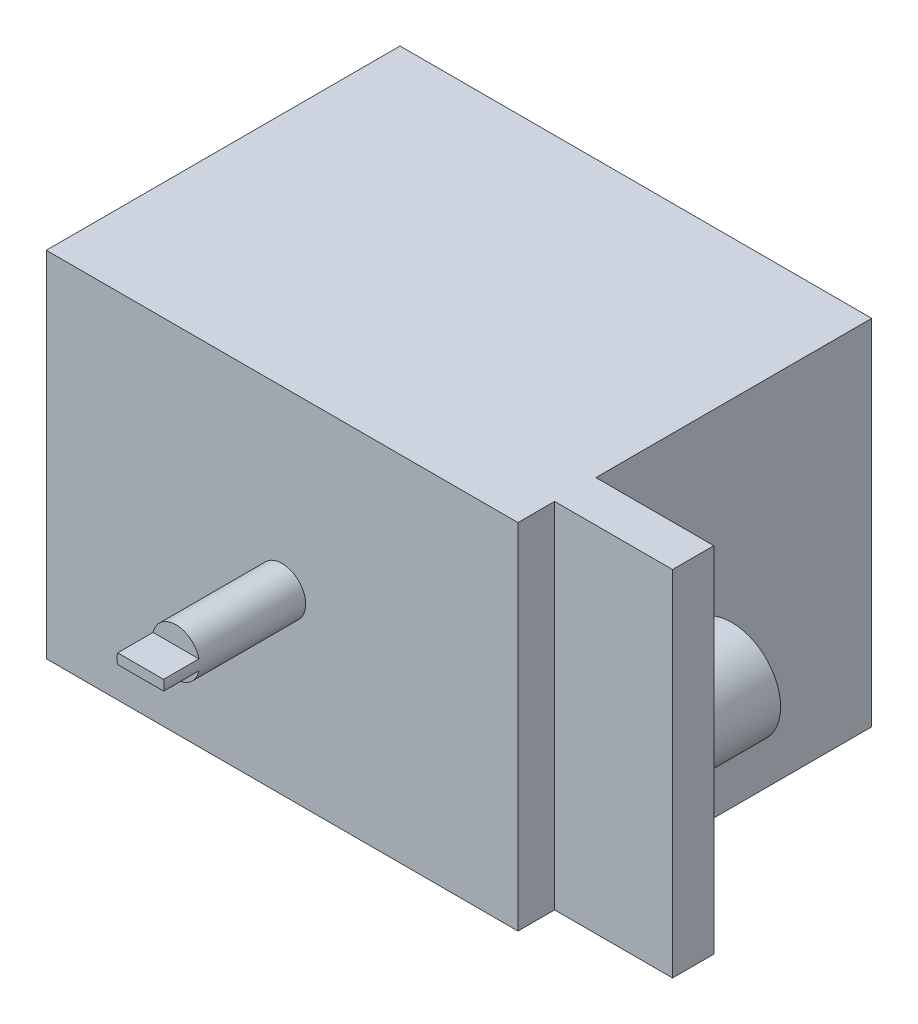
ISO-10303-21;
HEADER;
FILE_DESCRIPTION(('STEP AP214'),'2;1');
FILE_NAME('part.step','',(''),(''),'','','');
FILE_SCHEMA(('AUTOMOTIVE_DESIGN { 1 0 10303 214 1 1 1 1 }'));
ENDSEC;
DATA;
#1=APPLICATION_CONTEXT('core data for automotive mechanical design processes');
#2=APPLICATION_PROTOCOL_DEFINITION('international standard','automotive_design',2000,#1);
#3=PRODUCT_CONTEXT('',#1,'mechanical');
#4=PRODUCT('Part','Part','',(#3));
#5=PRODUCT_RELATED_PRODUCT_CATEGORY('part','',(#4));
#6=PRODUCT_DEFINITION_FORMATION('','',#4);
#7=PRODUCT_DEFINITION_CONTEXT('part definition',#1,'design');
#8=PRODUCT_DEFINITION('design','',#6,#7);
#9=PRODUCT_DEFINITION_SHAPE('','',#8);
#10=(LENGTH_UNIT() NAMED_UNIT(*) SI_UNIT(.MILLI.,.METRE.));
#11=(NAMED_UNIT(*) PLANE_ANGLE_UNIT() SI_UNIT($,.RADIAN.));
#12=(NAMED_UNIT(*) SI_UNIT($,.STERADIAN.) SOLID_ANGLE_UNIT());
#13=UNCERTAINTY_MEASURE_WITH_UNIT(LENGTH_MEASURE(1.E-05),#10,'distance_accuracy_value','');
#14=(GEOMETRIC_REPRESENTATION_CONTEXT(3) GLOBAL_UNCERTAINTY_ASSIGNED_CONTEXT((#13)) GLOBAL_UNIT_ASSIGNED_CONTEXT((#10,
#11,#12)) REPRESENTATION_CONTEXT('',''));
#15=CARTESIAN_POINT('',(0.,0.,0.));
#16=DIRECTION('',(0.,0.,1.));
#17=DIRECTION('',(1.,0.,0.));
#18=AXIS2_PLACEMENT_3D('',#15,#16,#17);
#19=CARTESIAN_POINT('',(100.,-75.0000000000002,150.));
#20=DIRECTION('',(-1.,0.,0.));
#21=DIRECTION('',(0.,0.,1.));
#22=AXIS2_PLACEMENT_3D('',#19,#20,#21);
#23=PLANE('',#22);
#24=DIRECTION('',(0.,-1.,0.));
#25=VECTOR('',#24,1.);
#26=CARTESIAN_POINT('',(99.9999999999999,74.9999999999997,134.460411656031));
#27=LINE('',#26,#25);
#28=CARTESIAN_POINT('',(99.9999999999999,74.9999999999997,134.460411656031));
#29=VERTEX_POINT('',#28);
#30=CARTESIAN_POINT('',(100.,-75.0000000000007,134.460411656031));
#31=VERTEX_POINT('',#30);
#32=EDGE_CURVE('E168',#29,#31,#27,.T.);
#33=ORIENTED_EDGE('',*,*,#32,.F.);
#34=DIRECTION('',(0.,0.,-1.));
#35=VECTOR('',#34,1.);
#36=CARTESIAN_POINT('',(100.,74.9999999999997,150.));
#37=LINE('',#36,#35);
#38=CARTESIAN_POINT('',(100.,74.9999999999997,150.));
#39=VERTEX_POINT('',#38);
#40=EDGE_CURVE('E236',#39,#29,#37,.T.);
#41=ORIENTED_EDGE('',*,*,#40,.F.);
#42=DIRECTION('',(0.,1.,0.));
#43=VECTOR('',#42,1.);
#44=CARTESIAN_POINT('',(100.,-75.0000000000002,150.));
#45=LINE('',#44,#43);
#46=CARTESIAN_POINT('',(100.,-75.0000000000002,150.));
#47=VERTEX_POINT('',#46);
#48=EDGE_CURVE('E208',#47,#39,#45,.T.);
#49=ORIENTED_EDGE('',*,*,#48,.F.);
#50=DIRECTION('',(0.,0.,-1.));
#51=VECTOR('',#50,1.);
#52=CARTESIAN_POINT('',(100.,-75.0000000000002,150.));
#53=LINE('',#52,#51);
#54=EDGE_CURVE('E227',#47,#31,#53,.T.);
#55=ORIENTED_EDGE('',*,*,#54,.T.);
#56=EDGE_LOOP('',(#33,#41,#49,#55));
#57=FACE_BOUND('',#56,.T.);
#58=ADVANCED_FACE('F46',(#57),#23,.F.);
#59=DIRECTION('',(0.,1.,0.));
#60=VECTOR('',#59,1.);
#61=CARTESIAN_POINT('',(100.,74.9999999999988,116.966786996462));
#62=LINE('',#61,#60);
#63=CARTESIAN_POINT('',(100.,-75.0000000000016,116.966786996462));
#64=VERTEX_POINT('',#63);
#65=CARTESIAN_POINT('',(100.,74.9999999999988,116.966786996462));
#66=VERTEX_POINT('',#65);
#67=EDGE_CURVE('E173',#64,#66,#62,.T.);
#68=ORIENTED_EDGE('',*,*,#67,.F.);
#69=CARTESIAN_POINT('',(100.,-75.0000000000002,0.));
#70=VERTEX_POINT('',#69);
#71=EDGE_CURVE('E218',#64,#70,#53,.T.);
#72=ORIENTED_EDGE('',*,*,#71,.T.);
#73=DIRECTION('',(0.,1.,0.));
#74=VECTOR('',#73,1.);
#75=CARTESIAN_POINT('',(100.,-75.0000000000002,0.));
#76=LINE('',#75,#74);
#77=CARTESIAN_POINT('',(100.,75.0000000000002,0.));
#78=VERTEX_POINT('',#77);
#79=EDGE_CURVE('E205',#70,#78,#76,.T.);
#80=ORIENTED_EDGE('',*,*,#79,.T.);
#81=EDGE_CURVE('E235',#66,#78,#37,.T.);
#82=ORIENTED_EDGE('',*,*,#81,.F.);
#83=EDGE_LOOP('',(#68,#72,#80,#82));
#84=FACE_BOUND('',#83,.T.);
#85=ADVANCED_FACE('F268',(#84),#23,.F.);
#86=CARTESIAN_POINT('',(-100.,74.9999999999997,150.));
#87=DIRECTION('',(0.,-1.,0.));
#88=DIRECTION('',(0.,0.,-1.));
#89=AXIS2_PLACEMENT_3D('',#86,#87,#88);
#90=PLANE('',#89);
#91=DIRECTION('',(-1.,0.,0.));
#92=VECTOR('',#91,1.);
#93=CARTESIAN_POINT('',(-100.,74.9999999999997,0.));
#94=LINE('',#93,#92);
#95=CARTESIAN_POINT('',(-100.,74.9999999999997,0.));
#96=VERTEX_POINT('',#95);
#97=EDGE_CURVE('E221',#78,#96,#94,.T.);
#98=ORIENTED_EDGE('',*,*,#97,.T.);
#99=DIRECTION('',(0.,0.,-1.));
#100=VECTOR('',#99,1.);
#101=CARTESIAN_POINT('',(-100.,74.9999999999997,150.));
#102=LINE('',#101,#100);
#103=CARTESIAN_POINT('',(-100.,74.9999999999997,150.));
#104=VERTEX_POINT('',#103);
#105=EDGE_CURVE('E232',#104,#96,#102,.T.);
#106=ORIENTED_EDGE('',*,*,#105,.F.);
#107=DIRECTION('',(-1.,0.,0.));
#108=VECTOR('',#107,1.);
#109=CARTESIAN_POINT('',(-100.,74.9999999999997,150.));
#110=LINE('',#109,#108);
#111=EDGE_CURVE('E211',#39,#104,#110,.T.);
#112=ORIENTED_EDGE('',*,*,#111,.F.);
#113=ORIENTED_EDGE('',*,*,#40,.T.);
#114=DIRECTION('',(-1.,0.,0.));
#115=VECTOR('',#114,1.);
#116=CARTESIAN_POINT('',(150.,74.9999999999983,134.460411656031));
#117=LINE('',#116,#115);
#118=CARTESIAN_POINT('',(150.,74.9999999999983,134.460411656031));
#119=VERTEX_POINT('',#118);
#120=EDGE_CURVE('E179',#119,#29,#117,.T.);
#121=ORIENTED_EDGE('',*,*,#120,.F.);
#122=DIRECTION('',(0.,0.,1.));
#123=VECTOR('',#122,1.);
#124=CARTESIAN_POINT('',(150.,74.9999999999983,134.460411656031));
#125=LINE('',#124,#123);
#126=CARTESIAN_POINT('',(150.,74.9999999999984,116.966786996462));
#127=VERTEX_POINT('',#126);
#128=EDGE_CURVE('E177',#127,#119,#125,.T.);
#129=ORIENTED_EDGE('',*,*,#128,.F.);
#130=DIRECTION('',(-1.,0.,0.));
#131=VECTOR('',#130,1.);
#132=CARTESIAN_POINT('',(150.,74.9999999999984,116.966786996462));
#133=LINE('',#132,#131);
#134=EDGE_CURVE('E186',#127,#66,#133,.T.);
#135=ORIENTED_EDGE('',*,*,#134,.T.);
#136=ORIENTED_EDGE('',*,*,#81,.T.);
#137=EDGE_LOOP('',(#98,#106,#112,#113,#121,#129,#135,#136));
#138=FACE_BOUND('',#137,.T.);
#139=ADVANCED_FACE('F274',(#138),#90,.F.);
#140=CARTESIAN_POINT('',(-100.,-75.0000000000002,150.));
#141=DIRECTION('',(1.,0.,0.));
#142=DIRECTION('',(0.,0.,-1.));
#143=AXIS2_PLACEMENT_3D('',#140,#141,#142);
#144=PLANE('',#143);
#145=DIRECTION('',(0.,-1.,0.));
#146=VECTOR('',#145,1.);
#147=CARTESIAN_POINT('',(-100.,-75.0000000000003,0.));
#148=LINE('',#147,#146);
#149=CARTESIAN_POINT('',(-100.,-75.0000000000003,0.));
#150=VERTEX_POINT('',#149);
#151=EDGE_CURVE('E223',#96,#150,#148,.T.);
#152=ORIENTED_EDGE('',*,*,#151,.T.);
#153=DIRECTION('',(0.,0.,-1.));
#154=VECTOR('',#153,1.);
#155=CARTESIAN_POINT('',(-100.,-75.0000000000002,150.));
#156=LINE('',#155,#154);
#157=CARTESIAN_POINT('',(-100.,-75.0000000000002,150.));
#158=VERTEX_POINT('',#157);
#159=EDGE_CURVE('E229',#158,#150,#156,.T.);
#160=ORIENTED_EDGE('',*,*,#159,.F.);
#161=DIRECTION('',(0.,-1.,0.));
#162=VECTOR('',#161,1.);
#163=CARTESIAN_POINT('',(-100.,-75.0000000000002,150.));
#164=LINE('',#163,#162);
#165=EDGE_CURVE('E214',#104,#158,#164,.T.);
#166=ORIENTED_EDGE('',*,*,#165,.F.);
#167=ORIENTED_EDGE('',*,*,#105,.T.);
#168=EDGE_LOOP('',(#152,#160,#166,#167));
#169=FACE_BOUND('',#168,.T.);
#170=ADVANCED_FACE('F315',(#169),#144,.F.);
#171=CARTESIAN_POINT('',(-100.,-75.0000000000002,150.));
#172=DIRECTION('',(0.,1.,0.));
#173=DIRECTION('',(0.,0.,1.));
#174=AXIS2_PLACEMENT_3D('',#171,#172,#173);
#175=PLANE('',#174);
#176=DIRECTION('',(1.,0.,0.));
#177=VECTOR('',#176,1.);
#178=CARTESIAN_POINT('',(-100.,-75.0000000000003,0.));
#179=LINE('',#178,#177);
#180=EDGE_CURVE('E212',#150,#70,#179,.T.);
#181=ORIENTED_EDGE('',*,*,#180,.T.);
#182=ORIENTED_EDGE('',*,*,#71,.F.);
#183=DIRECTION('',(-1.,0.,0.));
#184=VECTOR('',#183,1.);
#185=CARTESIAN_POINT('',(150.,-75.0000000000016,116.966786996461));
#186=LINE('',#185,#184);
#187=CARTESIAN_POINT('',(150.,-75.0000000000016,116.966786996461));
#188=VERTEX_POINT('',#187);
#189=EDGE_CURVE('E189',#188,#64,#186,.T.);
#190=ORIENTED_EDGE('',*,*,#189,.F.);
#191=DIRECTION('',(0.,0.,-1.));
#192=VECTOR('',#191,1.);
#193=CARTESIAN_POINT('',(150.,-75.0000000000016,134.46041165603));
#194=LINE('',#193,#192);
#195=CARTESIAN_POINT('',(150.,-75.0000000000016,134.46041165603));
#196=VERTEX_POINT('',#195);
#197=EDGE_CURVE('E172',#196,#188,#194,.T.);
#198=ORIENTED_EDGE('',*,*,#197,.F.);
#199=DIRECTION('',(-1.,0.,0.));
#200=VECTOR('',#199,1.);
#201=CARTESIAN_POINT('',(150.,-75.0000000000016,134.46041165603));
#202=LINE('',#201,#200);
#203=EDGE_CURVE('E192',#196,#31,#202,.T.);
#204=ORIENTED_EDGE('',*,*,#203,.T.);
#205=ORIENTED_EDGE('',*,*,#54,.F.);
#206=DIRECTION('',(1.,0.,0.));
#207=VECTOR('',#206,1.);
#208=CARTESIAN_POINT('',(-100.,-75.0000000000002,150.));
#209=LINE('',#208,#207);
#210=EDGE_CURVE('E216',#158,#47,#209,.T.);
#211=ORIENTED_EDGE('',*,*,#210,.F.);
#212=ORIENTED_EDGE('',*,*,#159,.T.);
#213=EDGE_LOOP('',(#181,#182,#190,#198,#204,#205,#211,#212));
#214=FACE_BOUND('',#213,.T.);
#215=ADVANCED_FACE('F308',(#214),#175,.F.);
#216=CARTESIAN_POINT('',(0.,0.,150.));
#217=DIRECTION('',(0.,0.,-1.));
#218=DIRECTION('',(-1.,0.,0.));
#219=AXIS2_PLACEMENT_3D('',#216,#217,#218);
#220=PLANE('',#219);
#221=CARTESIAN_POINT('',(0.,0.,150.));
#222=DIRECTION('',(0.,0.,-1.));
#223=DIRECTION('',(-1.,0.,0.));
#224=AXIS2_PLACEMENT_3D('',#221,#222,#223);
#225=CIRCLE('',#224,10.);
#226=CARTESIAN_POINT('',(-10.,0.,150.));
#227=VERTEX_POINT('',#226);
#228=EDGE_CURVE('E248',#227,#227,#225,.F.);
#229=ORIENTED_EDGE('',*,*,#228,.F.);
#230=EDGE_LOOP('',(#229));
#231=FACE_BOUND('',#230,.T.);
#232=ORIENTED_EDGE('',*,*,#48,.T.);
#233=ORIENTED_EDGE('',*,*,#111,.T.);
#234=ORIENTED_EDGE('',*,*,#165,.T.);
#235=ORIENTED_EDGE('',*,*,#210,.T.);
#236=EDGE_LOOP('',(#232,#233,#234,#235));
#237=FACE_BOUND('',#236,.T.);
#238=ADVANCED_FACE('F298',(#231,#237),#220,.F.);
#239=CARTESIAN_POINT('',(0.,0.,0.));
#240=DIRECTION('',(0.,0.,-1.));
#241=DIRECTION('',(-1.,0.,0.));
#242=AXIS2_PLACEMENT_3D('',#239,#240,#241);
#243=PLANE('',#242);
#244=CARTESIAN_POINT('',(-80.018238541226,4.10911856179336,0.));
#245=DIRECTION('',(0.,0.,-1.));
#246=DIRECTION('',(-1.,0.,0.));
#247=AXIS2_PLACEMENT_3D('',#244,#245,#246);
#248=CIRCLE('',#247,14.8342414563809);
#249=CARTESIAN_POINT('',(-94.8524799976069,4.10911856179336,0.));
#250=VERTEX_POINT('',#249);
#251=EDGE_CURVE('E195',#250,#250,#248,.T.);
#252=ORIENTED_EDGE('',*,*,#251,.F.);
#253=EDGE_LOOP('',(#252));
#254=FACE_BOUND('',#253,.T.);
#255=CARTESIAN_POINT('',(-80.0182385412254,54.1091185617936,-8.88178419700125E-13));
#256=DIRECTION('',(0.,0.,-1.));
#257=DIRECTION('',(-1.,0.,0.));
#258=AXIS2_PLACEMENT_3D('',#255,#256,#257);
#259=CIRCLE('',#258,14.8342414563809);
#260=CARTESIAN_POINT('',(-94.8524799976064,54.1091185617936,-8.88178419700125E-13));
#261=VERTEX_POINT('',#260);
#262=EDGE_CURVE('E201',#261,#261,#259,.T.);
#263=ORIENTED_EDGE('',*,*,#262,.F.);
#264=EDGE_LOOP('',(#263));
#265=FACE_BOUND('',#264,.T.);
#266=ORIENTED_EDGE('',*,*,#79,.F.);
#267=ORIENTED_EDGE('',*,*,#180,.F.);
#268=ORIENTED_EDGE('',*,*,#151,.F.);
#269=ORIENTED_EDGE('',*,*,#97,.F.);
#270=EDGE_LOOP('',(#266,#267,#268,#269));
#271=FACE_BOUND('',#270,.T.);
#272=CARTESIAN_POINT('',(-80.0182385412254,-45.8908814382069,0.));
#273=DIRECTION('',(0.,0.,-1.));
#274=DIRECTION('',(-1.,0.,0.));
#275=AXIS2_PLACEMENT_3D('',#272,#273,#274);
#276=CIRCLE('',#275,14.8342414563809);
#277=CARTESIAN_POINT('',(-94.8524799976064,-45.8908814382069,0.));
#278=VERTEX_POINT('',#277);
#279=EDGE_CURVE('E239',#278,#278,#276,.T.);
#280=ORIENTED_EDGE('',*,*,#279,.F.);
#281=EDGE_LOOP('',(#280));
#282=FACE_BOUND('',#281,.T.);
#283=ADVANCED_FACE('F295',(#254,#265,#271,#282),#243,.T.);
#284=CARTESIAN_POINT('',(-80.0182385412254,54.1091185617936,4.99999999999945));
#285=DIRECTION('',(0.,0.,-1.));
#286=DIRECTION('',(-1.,0.,0.));
#287=AXIS2_PLACEMENT_3D('',#284,#285,#286);
#288=CYLINDRICAL_SURFACE('',#287,14.8342414563809);
#289=CARTESIAN_POINT('',(-80.0182385412254,54.1091185617936,4.99999999999945));
#290=DIRECTION('',(0.,0.,-1.));
#291=DIRECTION('',(-1.,0.,0.));
#292=AXIS2_PLACEMENT_3D('',#289,#290,#291);
#293=CIRCLE('',#292,14.8342414563809);
#294=CARTESIAN_POINT('',(-94.8524799976064,54.1091185617936,4.99999999999945));
#295=VERTEX_POINT('',#294);
#296=EDGE_CURVE('E202',#295,#295,#293,.T.);
#297=ORIENTED_EDGE('',*,*,#296,.F.);
#298=EDGE_LOOP('',(#297));
#299=FACE_BOUND('',#298,.T.);
#300=ORIENTED_EDGE('',*,*,#262,.T.);
#301=EDGE_LOOP('',(#300));
#302=FACE_BOUND('',#301,.T.);
#303=ADVANCED_FACE('F297',(#299,#302),#288,.F.);
#304=CARTESIAN_POINT('',(-80.0182385412254,54.1091185617936,4.99999999999945));
#305=DIRECTION('',(0.,0.,-1.));
#306=DIRECTION('',(-1.,0.,0.));
#307=AXIS2_PLACEMENT_3D('',#304,#305,#306);
#308=PLANE('',#307);
#309=ORIENTED_EDGE('',*,*,#296,.T.);
#310=EDGE_LOOP('',(#309));
#311=FACE_BOUND('',#310,.T.);
#312=ADVANCED_FACE('F305',(#311),#308,.T.);
#313=CARTESIAN_POINT('',(-80.018238541226,4.10911856179336,4.99999999999989));
#314=DIRECTION('',(0.,0.,-1.));
#315=DIRECTION('',(-1.,0.,0.));
#316=AXIS2_PLACEMENT_3D('',#313,#314,#315);
#317=CYLINDRICAL_SURFACE('',#316,14.8342414563809);
#318=CARTESIAN_POINT('',(-80.018238541226,4.10911856179336,4.99999999999989));
#319=DIRECTION('',(0.,0.,-1.));
#320=DIRECTION('',(-1.,0.,0.));
#321=AXIS2_PLACEMENT_3D('',#318,#319,#320);
#322=CIRCLE('',#321,14.8342414563809);
#323=CARTESIAN_POINT('',(-94.8524799976069,4.10911856179336,4.99999999999989));
#324=VERTEX_POINT('',#323);
#325=EDGE_CURVE('E198',#324,#324,#322,.T.);
#326=ORIENTED_EDGE('',*,*,#325,.F.);
#327=EDGE_LOOP('',(#326));
#328=FACE_BOUND('',#327,.T.);
#329=ORIENTED_EDGE('',*,*,#251,.T.);
#330=EDGE_LOOP('',(#329));
#331=FACE_BOUND('',#330,.T.);
#332=ADVANCED_FACE('F362',(#328,#331),#317,.F.);
#333=CARTESIAN_POINT('',(-80.018238541226,4.10911856179336,4.99999999999989));
#334=DIRECTION('',(0.,0.,-1.));
#335=DIRECTION('',(-1.,0.,0.));
#336=AXIS2_PLACEMENT_3D('',#333,#334,#335);
#337=PLANE('',#336);
#338=ORIENTED_EDGE('',*,*,#325,.T.);
#339=EDGE_LOOP('',(#338));
#340=FACE_BOUND('',#339,.T.);
#341=ADVANCED_FACE('F289',(#340),#337,.T.);
#342=CARTESIAN_POINT('',(-80.0182385412254,-45.8908814382069,4.99999999999989));
#343=DIRECTION('',(0.,0.,-1.));
#344=DIRECTION('',(-1.,0.,0.));
#345=AXIS2_PLACEMENT_3D('',#342,#343,#344);
#346=PLANE('',#345);
#347=CARTESIAN_POINT('',(-80.0182385412254,-45.8908814382069,4.99999999999989));
#348=DIRECTION('',(0.,0.,-1.));
#349=DIRECTION('',(-1.,0.,0.));
#350=AXIS2_PLACEMENT_3D('',#347,#348,#349);
#351=CIRCLE('',#350,14.8342414563809);
#352=CARTESIAN_POINT('',(-94.8524799976064,-45.8908814382069,4.99999999999989));
#353=VERTEX_POINT('',#352);
#354=EDGE_CURVE('E242',#353,#353,#351,.T.);
#355=ORIENTED_EDGE('',*,*,#354,.T.);
#356=EDGE_LOOP('',(#355));
#357=FACE_BOUND('',#356,.T.);
#358=ADVANCED_FACE('F48',(#357),#346,.T.);
#359=CARTESIAN_POINT('',(-80.0182385412254,-45.8908814382069,4.99999999999989));
#360=DIRECTION('',(0.,0.,-1.));
#361=DIRECTION('',(-1.,0.,0.));
#362=AXIS2_PLACEMENT_3D('',#359,#360,#361);
#363=CYLINDRICAL_SURFACE('',#362,14.8342414563809);
#364=ORIENTED_EDGE('',*,*,#354,.F.);
#365=EDGE_LOOP('',(#364));
#366=FACE_BOUND('',#365,.T.);
#367=ORIENTED_EDGE('',*,*,#279,.T.);
#368=EDGE_LOOP('',(#367));
#369=FACE_BOUND('',#368,.T.);
#370=ADVANCED_FACE('F278',(#366,#369),#363,.F.);
#371=CARTESIAN_POINT('',(150.,74.9999999999983,134.460411656031));
#372=DIRECTION('',(0.,0.,-1.));
#373=DIRECTION('',(-1.,0.,0.));
#374=AXIS2_PLACEMENT_3D('',#371,#372,#373);
#375=PLANE('',#374);
#376=ORIENTED_EDGE('',*,*,#32,.T.);
#377=ORIENTED_EDGE('',*,*,#203,.F.);
#378=DIRECTION('',(0.,-1.,0.));
#379=VECTOR('',#378,1.);
#380=CARTESIAN_POINT('',(150.,74.9999999999983,134.460411656031));
#381=LINE('',#380,#379);
#382=EDGE_CURVE('E169',#119,#196,#381,.T.);
#383=ORIENTED_EDGE('',*,*,#382,.F.);
#384=ORIENTED_EDGE('',*,*,#120,.T.);
#385=EDGE_LOOP('',(#376,#377,#383,#384));
#386=FACE_BOUND('',#385,.T.);
#387=ADVANCED_FACE('F280',(#386),#375,.F.);
#388=CARTESIAN_POINT('',(150.,74.9999999999984,116.966786996462));
#389=DIRECTION('',(0.,0.,1.));
#390=DIRECTION('',(1.,0.,0.));
#391=AXIS2_PLACEMENT_3D('',#388,#389,#390);
#392=PLANE('',#391);
#393=CARTESIAN_POINT('',(127.668059080904,-1.38777878078145E-12,116.966786996463));
#394=DIRECTION('',(0.,0.,1.));
#395=DIRECTION('',(1.,0.,0.));
#396=AXIS2_PLACEMENT_3D('',#393,#394,#395);
#397=CIRCLE('',#396,20.6577276033694);
#398=CARTESIAN_POINT('',(148.325786684273,-1.38777878078145E-12,116.966786996463));
#399=VERTEX_POINT('',#398);
#400=EDGE_CURVE('E245',#399,#399,#397,.F.);
#401=ORIENTED_EDGE('',*,*,#400,.F.);
#402=EDGE_LOOP('',(#401));
#403=FACE_BOUND('',#402,.T.);
#404=ORIENTED_EDGE('',*,*,#67,.T.);
#405=ORIENTED_EDGE('',*,*,#134,.F.);
#406=DIRECTION('',(0.,1.,0.));
#407=VECTOR('',#406,1.);
#408=CARTESIAN_POINT('',(150.,74.9999999999984,116.966786996462));
#409=LINE('',#408,#407);
#410=EDGE_CURVE('E175',#188,#127,#409,.T.);
#411=ORIENTED_EDGE('',*,*,#410,.F.);
#412=ORIENTED_EDGE('',*,*,#189,.T.);
#413=EDGE_LOOP('',(#404,#405,#411,#412));
#414=FACE_BOUND('',#413,.T.);
#415=ADVANCED_FACE('F286',(#403,#414),#392,.F.);
#416=CARTESIAN_POINT('',(150.,0.,0.));
#417=DIRECTION('',(1.,0.,0.));
#418=DIRECTION('',(0.,0.,-1.));
#419=AXIS2_PLACEMENT_3D('',#416,#417,#418);
#420=PLANE('',#419);
#421=ORIENTED_EDGE('',*,*,#382,.T.);
#422=ORIENTED_EDGE('',*,*,#197,.T.);
#423=ORIENTED_EDGE('',*,*,#410,.T.);
#424=ORIENTED_EDGE('',*,*,#128,.T.);
#425=EDGE_LOOP('',(#421,#422,#423,#424));
#426=FACE_BOUND('',#425,.T.);
#427=ADVANCED_FACE('F340',(#426),#420,.T.);
#428=CARTESIAN_POINT('',(127.668059080904,-4.9960036108132E-13,86.9667869964625));
#429=DIRECTION('',(0.,0.,1.));
#430=DIRECTION('',(1.,0.,0.));
#431=AXIS2_PLACEMENT_3D('',#428,#429,#430);
#432=CYLINDRICAL_SURFACE('',#431,20.6577276033694);
#433=CARTESIAN_POINT('',(127.668059080904,-4.9960036108132E-13,86.9667869964625));
#434=DIRECTION('',(0.,0.,-1.));
#435=DIRECTION('',(-1.,0.,0.));
#436=AXIS2_PLACEMENT_3D('',#433,#434,#435);
#437=CIRCLE('',#436,20.6577276033694);
#438=CARTESIAN_POINT('',(107.010331477534,-4.9960036108132E-13,86.9667869964625));
#439=VERTEX_POINT('',#438);
#440=EDGE_CURVE('E165',#439,#439,#437,.T.);
#441=ORIENTED_EDGE('',*,*,#440,.F.);
#442=EDGE_LOOP('',(#441));
#443=FACE_BOUND('',#442,.T.);
#444=ORIENTED_EDGE('',*,*,#400,.T.);
#445=EDGE_LOOP('',(#444));
#446=FACE_BOUND('',#445,.T.);
#447=ADVANCED_FACE('F348',(#443,#446),#432,.T.);
#448=CARTESIAN_POINT('',(127.668059080904,-4.9960036108132E-13,86.9667869964625));
#449=DIRECTION('',(0.,0.,-1.));
#450=DIRECTION('',(-1.,0.,0.));
#451=AXIS2_PLACEMENT_3D('',#448,#449,#450);
#452=PLANE('',#451);
#453=ORIENTED_EDGE('',*,*,#440,.T.);
#454=EDGE_LOOP('',(#453));
#455=FACE_BOUND('',#454,.T.);
#456=ADVANCED_FACE('F264',(#455),#452,.T.);
#457=CARTESIAN_POINT('',(0.,-1.38777878078145E-12,210.));
#458=DIRECTION('',(0.,0.,-1.));
#459=DIRECTION('',(-1.,0.,0.));
#460=AXIS2_PLACEMENT_3D('',#457,#458,#459);
#461=CYLINDRICAL_SURFACE('',#460,10.);
#462=CARTESIAN_POINT('',(0.,-1.38777878078145E-12,210.));
#463=DIRECTION('',(0.,0.,1.));
#464=DIRECTION('',(1.,0.,0.));
#465=AXIS2_PLACEMENT_3D('',#462,#463,#464);
#466=CIRCLE('',#465,10.);
#467=CARTESIAN_POINT('',(9.799364734556,-1.99310080004761,210.));
#468=VERTEX_POINT('',#467);
#469=CARTESIAN_POINT('',(9.73007675203206,2.30772754014819,210.));
#470=VERTEX_POINT('',#469);
#471=EDGE_CURVE('E149',#468,#470,#466,.T.);
#472=ORIENTED_EDGE('',*,*,#471,.F.);
#473=DIRECTION('',(0.,0.,1.));
#474=VECTOR('',#473,1.);
#475=CARTESIAN_POINT('',(9.799364734556,-1.99310080004761,195.));
#476=LINE('',#475,#474);
#477=CARTESIAN_POINT('',(9.799364734556,-1.99310080004761,195.));
#478=VERTEX_POINT('',#477);
#479=EDGE_CURVE('E61',#478,#468,#476,.T.);
#480=ORIENTED_EDGE('',*,*,#479,.F.);
#481=CARTESIAN_POINT('',(0.,-8.88178419700125E-13,195.));
#482=DIRECTION('',(0.,0.,-1.));
#483=DIRECTION('',(-1.,0.,0.));
#484=AXIS2_PLACEMENT_3D('',#481,#482,#483);
#485=CIRCLE('',#484,10.);
#486=CARTESIAN_POINT('',(-9.79936473455557,-1.99310080004761,195.));
#487=VERTEX_POINT('',#486);
#488=EDGE_CURVE('E13',#478,#487,#485,.T.);
#489=ORIENTED_EDGE('',*,*,#488,.T.);
#490=DIRECTION('',(0.,0.,-1.));
#491=VECTOR('',#490,1.);
#492=CARTESIAN_POINT('',(-9.79936473455558,-1.99310080004761,210.));
#493=LINE('',#492,#491);
#494=CARTESIAN_POINT('',(-9.79936473455558,-1.99310080004761,210.));
#495=VERTEX_POINT('',#494);
#496=EDGE_CURVE('E142',#487,#495,#493,.F.);
#497=ORIENTED_EDGE('',*,*,#496,.T.);
#498=CARTESIAN_POINT('',(-9.73007675203209,2.30772754014719,210.));
#499=VERTEX_POINT('',#498);
#500=EDGE_CURVE('E162',#499,#495,#466,.T.);
#501=ORIENTED_EDGE('',*,*,#500,.F.);
#502=DIRECTION('',(0.,0.,1.));
#503=VECTOR('',#502,1.);
#504=CARTESIAN_POINT('',(-9.73007675203208,2.30772754014769,195.));
#505=LINE('',#504,#503);
#506=CARTESIAN_POINT('',(-9.73007675203208,2.30772754014769,195.));
#507=VERTEX_POINT('',#506);
#508=EDGE_CURVE('E69',#507,#499,#505,.T.);
#509=ORIENTED_EDGE('',*,*,#508,.F.);
#510=CARTESIAN_POINT('',(0.,-8.88178419700125E-13,195.));
#511=DIRECTION('',(0.,0.,-1.));
#512=DIRECTION('',(-1.,0.,0.));
#513=AXIS2_PLACEMENT_3D('',#510,#511,#512);
#514=CIRCLE('',#513,10.);
#515=CARTESIAN_POINT('',(9.73007675203251,2.30772754014819,195.));
#516=VERTEX_POINT('',#515);
#517=EDGE_CURVE('E54',#507,#516,#514,.T.);
#518=ORIENTED_EDGE('',*,*,#517,.T.);
#519=DIRECTION('',(0.,0.,-1.));
#520=VECTOR('',#519,1.);
#521=CARTESIAN_POINT('',(9.73007675203206,2.30772754014819,210.));
#522=LINE('',#521,#520);
#523=EDGE_CURVE('E160',#516,#470,#522,.F.);
#524=ORIENTED_EDGE('',*,*,#523,.T.);
#525=EDGE_LOOP('',(#472,#480,#489,#497,#501,#509,#518,#524));
#526=FACE_BOUND('',#525,.T.);
#527=ORIENTED_EDGE('',*,*,#228,.T.);
#528=EDGE_LOOP('',(#527));
#529=FACE_BOUND('',#528,.T.);
#530=ADVANCED_FACE('F146',(#526,#529),#461,.T.);
#531=CARTESIAN_POINT('',(0.,-1.38777878078145E-12,210.));
#532=DIRECTION('',(0.,0.,1.));
#533=DIRECTION('',(1.,0.,0.));
#534=AXIS2_PLACEMENT_3D('',#531,#532,#533);
#535=PLANE('',#534);
#536=DIRECTION('',(-1.,0.,0.));
#537=VECTOR('',#536,1.);
#538=CARTESIAN_POINT('',(9.799364734556,-1.99310080004761,210.));
#539=LINE('',#538,#537);
#540=EDGE_CURVE('E143',#468,#495,#539,.T.);
#541=ORIENTED_EDGE('',*,*,#540,.F.);
#542=ORIENTED_EDGE('',*,*,#471,.T.);
#543=DIRECTION('',(1.,0.,0.));
#544=VECTOR('',#543,1.);
#545=CARTESIAN_POINT('',(-9.73007675203209,2.30772754014719,210.));
#546=LINE('',#545,#544);
#547=EDGE_CURVE('E151',#499,#470,#546,.T.);
#548=ORIENTED_EDGE('',*,*,#547,.F.);
#549=ORIENTED_EDGE('',*,*,#500,.T.);
#550=EDGE_LOOP('',(#541,#542,#548,#549));
#551=FACE_BOUND('',#550,.T.);
#552=ADVANCED_FACE('F256',(#551),#535,.T.);
#553=CARTESIAN_POINT('',(0.,-8.88178419700125E-13,195.));
#554=DIRECTION('',(0.,0.,-1.));
#555=DIRECTION('',(-1.,0.,0.));
#556=AXIS2_PLACEMENT_3D('',#553,#554,#555);
#557=PLANE('',#556);
#558=DIRECTION('',(1.,0.,0.));
#559=VECTOR('',#558,1.);
#560=CARTESIAN_POINT('',(-9.73007675203208,2.30772754014769,195.));
#561=LINE('',#560,#559);
#562=EDGE_CURVE('E155',#507,#516,#561,.T.);
#563=ORIENTED_EDGE('',*,*,#562,.T.);
#564=ORIENTED_EDGE('',*,*,#517,.F.);
#565=EDGE_LOOP('',(#563,#564));
#566=FACE_BOUND('',#565,.T.);
#567=ADVANCED_FACE('F253',(#566),#557,.F.);
#568=CARTESIAN_POINT('',(-9.73007675203208,2.30772754014769,195.));
#569=DIRECTION('',(0.,-1.,0.));
#570=DIRECTION('',(0.,0.,-1.));
#571=AXIS2_PLACEMENT_3D('',#568,#569,#570);
#572=PLANE('',#571);
#573=ORIENTED_EDGE('',*,*,#562,.F.);
#574=ORIENTED_EDGE('',*,*,#508,.T.);
#575=ORIENTED_EDGE('',*,*,#547,.T.);
#576=ORIENTED_EDGE('',*,*,#523,.F.);
#577=EDGE_LOOP('',(#573,#574,#575,#576));
#578=FACE_BOUND('',#577,.T.);
#579=ADVANCED_FACE('F254',(#578),#572,.F.);
#580=CARTESIAN_POINT('',(0.,-8.88178419700125E-13,195.));
#581=DIRECTION('',(0.,0.,-1.));
#582=DIRECTION('',(-1.,0.,0.));
#583=AXIS2_PLACEMENT_3D('',#580,#581,#582);
#584=PLANE('',#583);
#585=DIRECTION('',(-1.,0.,0.));
#586=VECTOR('',#585,1.);
#587=CARTESIAN_POINT('',(9.799364734556,-1.99310080004761,195.));
#588=LINE('',#587,#586);
#589=EDGE_CURVE('E138',#478,#487,#588,.T.);
#590=ORIENTED_EDGE('',*,*,#589,.T.);
#591=ORIENTED_EDGE('',*,*,#488,.F.);
#592=EDGE_LOOP('',(#590,#591));
#593=FACE_BOUND('',#592,.T.);
#594=ADVANCED_FACE('F137',(#593),#584,.F.);
#595=CARTESIAN_POINT('',(9.799364734556,-1.99310080004761,195.));
#596=DIRECTION('',(0.,1.,0.));
#597=DIRECTION('',(-1.,0.,0.));
#598=AXIS2_PLACEMENT_3D('',#595,#596,#597);
#599=PLANE('',#598);
#600=ORIENTED_EDGE('',*,*,#589,.F.);
#601=ORIENTED_EDGE('',*,*,#479,.T.);
#602=ORIENTED_EDGE('',*,*,#540,.T.);
#603=ORIENTED_EDGE('',*,*,#496,.F.);
#604=EDGE_LOOP('',(#600,#601,#602,#603));
#605=FACE_BOUND('',#604,.T.);
#606=ADVANCED_FACE('F141',(#605),#599,.F.);
#607=CLOSED_SHELL('',(#58,#85,#139,#170,#215,#238,#283,#303,#312,#332,#341,#358,#370,#387,#415,
#427,#447,#456,#530,#552,#567,#579,#594,#606));
#608=MANIFOLD_SOLID_BREP('B2',#607);
#609=ADVANCED_BREP_SHAPE_REPRESENTATION('',(#18,#608),#14);
#610=SHAPE_DEFINITION_REPRESENTATION(#9,#609);
ENDSEC;
END-ISO-10303-21;
